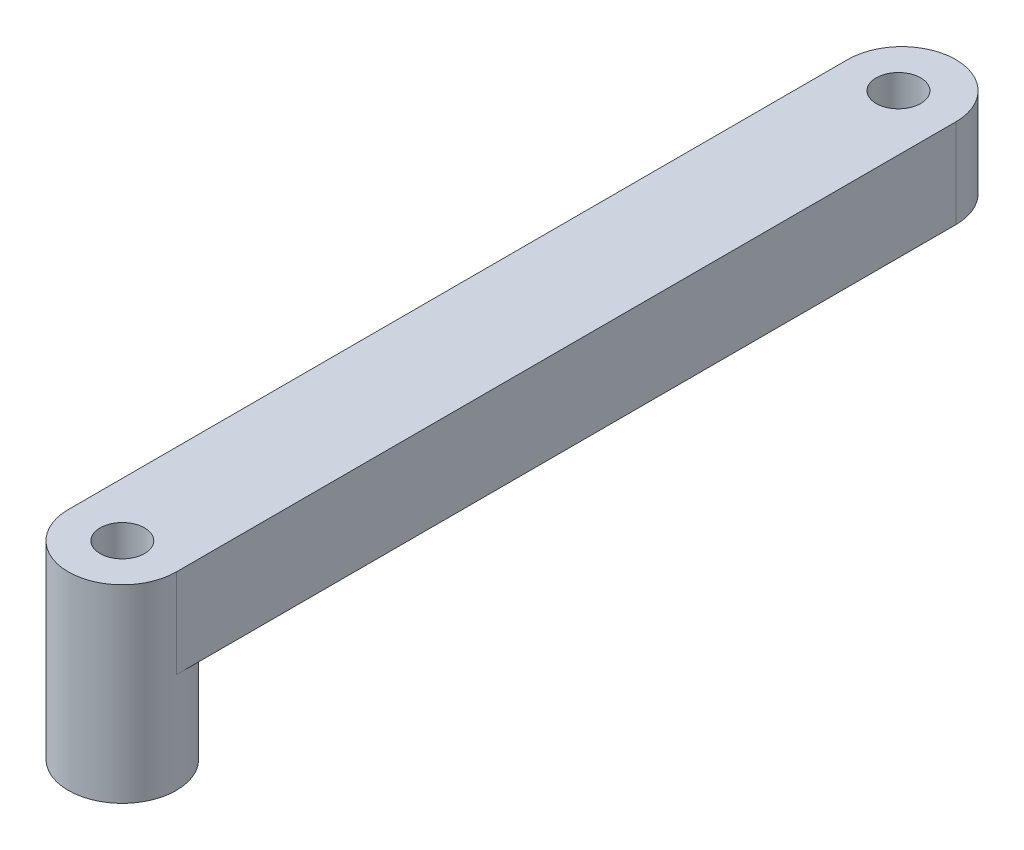
ISO-10303-21;
HEADER;
FILE_DESCRIPTION(('STEP AP214'),'2;1');
FILE_NAME('part.step','',(''),(''),'','','');
FILE_SCHEMA(('AUTOMOTIVE_DESIGN { 1 0 10303 214 1 1 1 1 }'));
ENDSEC;
DATA;
#1=APPLICATION_CONTEXT('core data for automotive mechanical design processes');
#2=APPLICATION_PROTOCOL_DEFINITION('international standard','automotive_design',2000,#1);
#3=PRODUCT_CONTEXT('',#1,'mechanical');
#4=PRODUCT('Part','Part','',(#3));
#5=PRODUCT_RELATED_PRODUCT_CATEGORY('part','',(#4));
#6=PRODUCT_DEFINITION_FORMATION('','',#4);
#7=PRODUCT_DEFINITION_CONTEXT('part definition',#1,'design');
#8=PRODUCT_DEFINITION('design','',#6,#7);
#9=PRODUCT_DEFINITION_SHAPE('','',#8);
#10=(LENGTH_UNIT() NAMED_UNIT(*) SI_UNIT(.MILLI.,.METRE.));
#11=(NAMED_UNIT(*) PLANE_ANGLE_UNIT() SI_UNIT($,.RADIAN.));
#12=(NAMED_UNIT(*) SI_UNIT($,.STERADIAN.) SOLID_ANGLE_UNIT());
#13=UNCERTAINTY_MEASURE_WITH_UNIT(LENGTH_MEASURE(1.E-05),#10,'distance_accuracy_value','');
#14=(GEOMETRIC_REPRESENTATION_CONTEXT(3) GLOBAL_UNCERTAINTY_ASSIGNED_CONTEXT((#13)) GLOBAL_UNIT_ASSIGNED_CONTEXT((#10,
#11,#12)) REPRESENTATION_CONTEXT('',''));
#15=CARTESIAN_POINT('',(0.,0.,0.));
#16=DIRECTION('',(0.,0.,1.));
#17=DIRECTION('',(1.,0.,0.));
#18=AXIS2_PLACEMENT_3D('',#15,#16,#17);
#19=CARTESIAN_POINT('',(0.,0.,0.));
#20=DIRECTION('',(0.,1.,0.));
#21=DIRECTION('',(0.,0.,1.));
#22=AXIS2_PLACEMENT_3D('',#19,#20,#21);
#23=PLANE('',#22);
#24=CARTESIAN_POINT('',(0.,0.,0.));
#25=DIRECTION('',(0.,1.,0.));
#26=DIRECTION('',(0.,0.,1.));
#27=AXIS2_PLACEMENT_3D('',#24,#25,#26);
#28=CIRCLE('',#27,4.85);
#29=CARTESIAN_POINT('',(0.,0.,4.85));
#30=VERTEX_POINT('',#29);
#31=EDGE_CURVE('E42',#30,#30,#28,.T.);
#32=ORIENTED_EDGE('',*,*,#31,.F.);
#33=EDGE_LOOP('',(#32));
#34=FACE_BOUND('',#33,.T.);
#35=CARTESIAN_POINT('',(0.,0.,0.));
#36=DIRECTION('',(0.,1.,0.));
#37=DIRECTION('',(0.,0.,1.));
#38=AXIS2_PLACEMENT_3D('',#35,#36,#37);
#39=CIRCLE('',#38,2.);
#40=CARTESIAN_POINT('',(0.,0.,2.));
#41=VERTEX_POINT('',#40);
#42=EDGE_CURVE('E110',#41,#41,#39,.T.);
#43=ORIENTED_EDGE('',*,*,#42,.T.);
#44=EDGE_LOOP('',(#43));
#45=FACE_BOUND('',#44,.T.);
#46=ADVANCED_FACE('F33',(#34,#45),#23,.F.);
#47=CARTESIAN_POINT('',(0.,9.,0.));
#48=DIRECTION('',(0.,-1.,0.));
#49=DIRECTION('',(0.,0.,-1.));
#50=AXIS2_PLACEMENT_3D('',#47,#48,#49);
#51=CYLINDRICAL_SURFACE('',#50,4.85);
#52=CARTESIAN_POINT('',(0.,9.,0.));
#53=DIRECTION('',(0.,1.,0.));
#54=DIRECTION('',(0.,0.,1.));
#55=AXIS2_PLACEMENT_3D('',#52,#53,#54);
#56=CIRCLE('',#55,4.85);
#57=CARTESIAN_POINT('',(4.85,9.,0.));
#58=VERTEX_POINT('',#57);
#59=CARTESIAN_POINT('',(-4.85,9.,0.));
#60=VERTEX_POINT('',#59);
#61=EDGE_CURVE('E11',#58,#60,#56,.T.);
#62=ORIENTED_EDGE('',*,*,#61,.F.);
#63=DIRECTION('',(0.,-1.,0.));
#64=VECTOR('',#63,1.);
#65=CARTESIAN_POINT('',(4.85,17.,0.));
#66=LINE('',#65,#64);
#67=CARTESIAN_POINT('',(4.85,17.,0.));
#68=VERTEX_POINT('',#67);
#69=EDGE_CURVE('E93',#68,#58,#66,.T.);
#70=ORIENTED_EDGE('',*,*,#69,.F.);
#71=CARTESIAN_POINT('',(0.,17.,0.));
#72=DIRECTION('',(0.,1.,0.));
#73=DIRECTION('',(0.,0.,1.));
#74=AXIS2_PLACEMENT_3D('',#71,#72,#73);
#75=CIRCLE('',#74,4.85);
#76=CARTESIAN_POINT('',(-4.85,17.,0.));
#77=VERTEX_POINT('',#76);
#78=EDGE_CURVE('E87',#77,#68,#75,.T.);
#79=ORIENTED_EDGE('',*,*,#78,.F.);
#80=DIRECTION('',(0.,-1.,0.));
#81=VECTOR('',#80,1.);
#82=CARTESIAN_POINT('',(-4.85,17.,0.));
#83=LINE('',#82,#81);
#84=EDGE_CURVE('E98',#77,#60,#83,.T.);
#85=ORIENTED_EDGE('',*,*,#84,.T.);
#86=EDGE_LOOP('',(#62,#70,#79,#85));
#87=FACE_BOUND('',#86,.T.);
#88=ORIENTED_EDGE('',*,*,#31,.T.);
#89=EDGE_LOOP('',(#88));
#90=FACE_BOUND('',#89,.T.);
#91=ADVANCED_FACE('F35',(#87,#90),#51,.T.);
#92=CARTESIAN_POINT('',(0.,9.,0.));
#93=DIRECTION('',(0.,-1.,0.));
#94=DIRECTION('',(0.,0.,-1.));
#95=AXIS2_PLACEMENT_3D('',#92,#93,#94);
#96=CYLINDRICAL_SURFACE('',#95,2.);
#97=ORIENTED_EDGE('',*,*,#42,.F.);
#98=EDGE_LOOP('',(#97));
#99=FACE_BOUND('',#98,.T.);
#100=CARTESIAN_POINT('',(0.,17.,0.));
#101=DIRECTION('',(0.,1.,0.));
#102=DIRECTION('',(0.,0.,1.));
#103=AXIS2_PLACEMENT_3D('',#100,#101,#102);
#104=CIRCLE('',#103,2.);
#105=CARTESIAN_POINT('',(0.,17.,2.));
#106=VERTEX_POINT('',#105);
#107=EDGE_CURVE('E37',#106,#106,#104,.T.);
#108=ORIENTED_EDGE('',*,*,#107,.T.);
#109=EDGE_LOOP('',(#108));
#110=FACE_BOUND('',#109,.T.);
#111=ADVANCED_FACE('F120',(#99,#110),#96,.F.);
#112=CARTESIAN_POINT('',(0.,9.,0.));
#113=DIRECTION('',(0.,1.,0.));
#114=DIRECTION('',(0.,0.,1.));
#115=AXIS2_PLACEMENT_3D('',#112,#113,#114);
#116=PLANE('',#115);
#117=CARTESIAN_POINT('',(-0.149999999999993,9.,-69.8522505064779));
#118=DIRECTION('',(0.,1.,0.));
#119=DIRECTION('',(0.,0.,1.));
#120=AXIS2_PLACEMENT_3D('',#117,#118,#119);
#121=CIRCLE('',#120,2.);
#122=CARTESIAN_POINT('',(-0.149999999999993,9.,-67.8522505064779));
#123=VERTEX_POINT('',#122);
#124=EDGE_CURVE('E128',#123,#123,#121,.T.);
#125=ORIENTED_EDGE('',*,*,#124,.T.);
#126=EDGE_LOOP('',(#125));
#127=FACE_BOUND('',#126,.T.);
#128=DIRECTION('',(0.,0.,-1.));
#129=VECTOR('',#128,1.);
#130=CARTESIAN_POINT('',(4.85,9.,-70.));
#131=LINE('',#130,#129);
#132=CARTESIAN_POINT('',(4.85,9.,-70.));
#133=VERTEX_POINT('',#132);
#134=EDGE_CURVE('E92',#58,#133,#131,.T.);
#135=ORIENTED_EDGE('',*,*,#134,.F.);
#136=ORIENTED_EDGE('',*,*,#61,.T.);
#137=DIRECTION('',(0.,0.,1.));
#138=VECTOR('',#137,1.);
#139=CARTESIAN_POINT('',(-4.85,9.,0.));
#140=LINE('',#139,#138);
#141=CARTESIAN_POINT('',(-4.85,9.,-70.));
#142=VERTEX_POINT('',#141);
#143=EDGE_CURVE('E104',#142,#60,#140,.T.);
#144=ORIENTED_EDGE('',*,*,#143,.F.);
#145=CARTESIAN_POINT('',(0.,9.,-70.));
#146=DIRECTION('',(0.,1.,0.));
#147=DIRECTION('',(0.,0.,-1.));
#148=AXIS2_PLACEMENT_3D('',#145,#146,#147);
#149=CIRCLE('',#148,4.85);
#150=EDGE_CURVE('E74',#133,#142,#149,.T.);
#151=ORIENTED_EDGE('',*,*,#150,.F.);
#152=EDGE_LOOP('',(#135,#136,#144,#151));
#153=FACE_BOUND('',#152,.T.);
#154=ADVANCED_FACE('F123',(#127,#153),#116,.F.);
#155=CARTESIAN_POINT('',(4.85,17.,-70.));
#156=DIRECTION('',(-1.,0.,0.));
#157=DIRECTION('',(0.,0.,1.));
#158=AXIS2_PLACEMENT_3D('',#155,#156,#157);
#159=PLANE('',#158);
#160=ORIENTED_EDGE('',*,*,#134,.T.);
#161=DIRECTION('',(0.,-1.,0.));
#162=VECTOR('',#161,1.);
#163=CARTESIAN_POINT('',(4.85,17.,-70.));
#164=LINE('',#163,#162);
#165=CARTESIAN_POINT('',(4.85,17.,-70.));
#166=VERTEX_POINT('',#165);
#167=EDGE_CURVE('E90',#166,#133,#164,.T.);
#168=ORIENTED_EDGE('',*,*,#167,.F.);
#169=DIRECTION('',(0.,0.,-1.));
#170=VECTOR('',#169,1.);
#171=CARTESIAN_POINT('',(4.85,17.,-70.));
#172=LINE('',#171,#170);
#173=EDGE_CURVE('E82',#68,#166,#172,.T.);
#174=ORIENTED_EDGE('',*,*,#173,.F.);
#175=ORIENTED_EDGE('',*,*,#69,.T.);
#176=EDGE_LOOP('',(#160,#168,#174,#175));
#177=FACE_BOUND('',#176,.T.);
#178=ADVANCED_FACE('F91',(#177),#159,.F.);
#179=CARTESIAN_POINT('',(0.,17.,-70.));
#180=DIRECTION('',(0.,-1.,0.));
#181=DIRECTION('',(0.,0.,-1.));
#182=AXIS2_PLACEMENT_3D('',#179,#180,#181);
#183=CYLINDRICAL_SURFACE('',#182,4.85);
#184=ORIENTED_EDGE('',*,*,#150,.T.);
#185=DIRECTION('',(0.,-1.,0.));
#186=VECTOR('',#185,1.);
#187=CARTESIAN_POINT('',(-4.85,17.,-70.));
#188=LINE('',#187,#186);
#189=CARTESIAN_POINT('',(-4.85,17.,-70.));
#190=VERTEX_POINT('',#189);
#191=EDGE_CURVE('E94',#190,#142,#188,.T.);
#192=ORIENTED_EDGE('',*,*,#191,.F.);
#193=CARTESIAN_POINT('',(0.,17.,-70.));
#194=DIRECTION('',(0.,1.,0.));
#195=DIRECTION('',(0.,0.,-1.));
#196=AXIS2_PLACEMENT_3D('',#193,#194,#195);
#197=CIRCLE('',#196,4.85);
#198=EDGE_CURVE('E85',#166,#190,#197,.T.);
#199=ORIENTED_EDGE('',*,*,#198,.F.);
#200=ORIENTED_EDGE('',*,*,#167,.T.);
#201=EDGE_LOOP('',(#184,#192,#199,#200));
#202=FACE_BOUND('',#201,.T.);
#203=ADVANCED_FACE('F96',(#202),#183,.T.);
#204=CARTESIAN_POINT('',(-4.85,17.,0.));
#205=DIRECTION('',(1.,0.,0.));
#206=DIRECTION('',(0.,0.,-1.));
#207=AXIS2_PLACEMENT_3D('',#204,#205,#206);
#208=PLANE('',#207);
#209=ORIENTED_EDGE('',*,*,#143,.T.);
#210=ORIENTED_EDGE('',*,*,#84,.F.);
#211=DIRECTION('',(0.,0.,1.));
#212=VECTOR('',#211,1.);
#213=CARTESIAN_POINT('',(-4.85,17.,0.));
#214=LINE('',#213,#212);
#215=EDGE_CURVE('E57',#190,#77,#214,.T.);
#216=ORIENTED_EDGE('',*,*,#215,.F.);
#217=ORIENTED_EDGE('',*,*,#191,.T.);
#218=EDGE_LOOP('',(#209,#210,#216,#217));
#219=FACE_BOUND('',#218,.T.);
#220=ADVANCED_FACE('F142',(#219),#208,.F.);
#221=CARTESIAN_POINT('',(0.,17.,0.));
#222=DIRECTION('',(0.,1.,0.));
#223=DIRECTION('',(0.,0.,1.));
#224=AXIS2_PLACEMENT_3D('',#221,#222,#223);
#225=PLANE('',#224);
#226=CARTESIAN_POINT('',(-0.149999999999993,17.,-69.8522505064779));
#227=DIRECTION('',(0.,1.,0.));
#228=DIRECTION('',(0.,0.,1.));
#229=AXIS2_PLACEMENT_3D('',#226,#227,#228);
#230=CIRCLE('',#229,2.);
#231=CARTESIAN_POINT('',(-0.149999999999993,17.,-67.8522505064779));
#232=VERTEX_POINT('',#231);
#233=EDGE_CURVE('E130',#232,#232,#230,.T.);
#234=ORIENTED_EDGE('',*,*,#233,.F.);
#235=EDGE_LOOP('',(#234));
#236=FACE_BOUND('',#235,.T.);
#237=ORIENTED_EDGE('',*,*,#107,.F.);
#238=EDGE_LOOP('',(#237));
#239=FACE_BOUND('',#238,.T.);
#240=ORIENTED_EDGE('',*,*,#78,.T.);
#241=ORIENTED_EDGE('',*,*,#173,.T.);
#242=ORIENTED_EDGE('',*,*,#198,.T.);
#243=ORIENTED_EDGE('',*,*,#215,.T.);
#244=EDGE_LOOP('',(#240,#241,#242,#243));
#245=FACE_BOUND('',#244,.T.);
#246=ADVANCED_FACE('F83',(#236,#239,#245),#225,.T.);
#247=CARTESIAN_POINT('',(-0.149999999999993,7.,-69.8522505064779));
#248=DIRECTION('',(0.,1.,0.));
#249=DIRECTION('',(0.,0.,1.));
#250=AXIS2_PLACEMENT_3D('',#247,#248,#249);
#251=CYLINDRICAL_SURFACE('',#250,2.);
#252=ORIENTED_EDGE('',*,*,#233,.T.);
#253=EDGE_LOOP('',(#252));
#254=FACE_BOUND('',#253,.T.);
#255=ORIENTED_EDGE('',*,*,#124,.F.);
#256=EDGE_LOOP('',(#255));
#257=FACE_BOUND('',#256,.T.);
#258=ADVANCED_FACE('F138',(#254,#257),#251,.F.);
#259=CLOSED_SHELL('',(#46,#91,#111,#154,#178,#203,#220,#246,#258));
#260=MANIFOLD_SOLID_BREP('B2',#259);
#261=ADVANCED_BREP_SHAPE_REPRESENTATION('',(#18,#260),#14);
#262=SHAPE_DEFINITION_REPRESENTATION(#9,#261);
ENDSEC;
END-ISO-10303-21;
